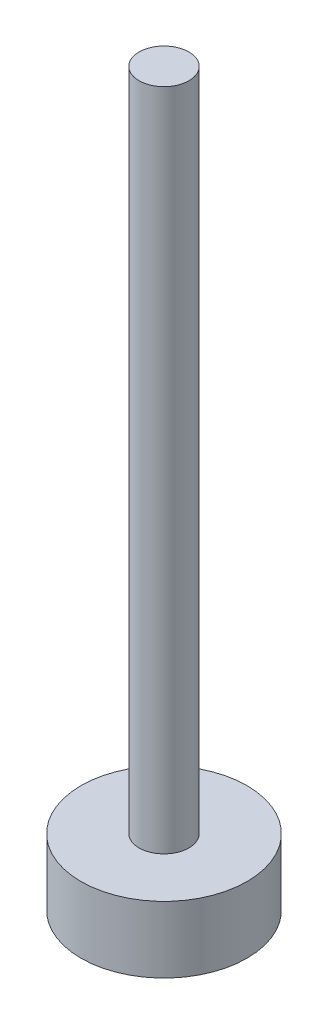
ISO-10303-21;
HEADER;
FILE_DESCRIPTION(('STEP AP214'),'2;1');
FILE_NAME('part.step','',(''),(''),'','','');
FILE_SCHEMA(('AUTOMOTIVE_DESIGN { 1 0 10303 214 1 1 1 1 }'));
ENDSEC;
DATA;
#1=APPLICATION_CONTEXT('core data for automotive mechanical design processes');
#2=APPLICATION_PROTOCOL_DEFINITION('international standard','automotive_design',2000,#1);
#3=PRODUCT_CONTEXT('',#1,'mechanical');
#4=PRODUCT('Part','Part','',(#3));
#5=PRODUCT_RELATED_PRODUCT_CATEGORY('part','',(#4));
#6=PRODUCT_DEFINITION_FORMATION('','',#4);
#7=PRODUCT_DEFINITION_CONTEXT('part definition',#1,'design');
#8=PRODUCT_DEFINITION('design','',#6,#7);
#9=PRODUCT_DEFINITION_SHAPE('','',#8);
#10=(LENGTH_UNIT() NAMED_UNIT(*) SI_UNIT(.MILLI.,.METRE.));
#11=(NAMED_UNIT(*) PLANE_ANGLE_UNIT() SI_UNIT($,.RADIAN.));
#12=(NAMED_UNIT(*) SI_UNIT($,.STERADIAN.) SOLID_ANGLE_UNIT());
#13=UNCERTAINTY_MEASURE_WITH_UNIT(LENGTH_MEASURE(1.E-05),#10,'distance_accuracy_value','');
#14=(GEOMETRIC_REPRESENTATION_CONTEXT(3) GLOBAL_UNCERTAINTY_ASSIGNED_CONTEXT((#13)) GLOBAL_UNIT_ASSIGNED_CONTEXT((#10,
#11,#12)) REPRESENTATION_CONTEXT('',''));
#15=CARTESIAN_POINT('',(0.,0.,0.));
#16=DIRECTION('',(0.,0.,1.));
#17=DIRECTION('',(1.,0.,0.));
#18=AXIS2_PLACEMENT_3D('',#15,#16,#17);
#19=CARTESIAN_POINT('',(0.,20.,0.));
#20=DIRECTION('',(0.,-1.,0.));
#21=DIRECTION('',(0.,0.,-1.));
#22=AXIS2_PLACEMENT_3D('',#19,#20,#21);
#23=CYLINDRICAL_SURFACE('',#22,25.);
#24=CARTESIAN_POINT('',(0.,20.,0.));
#25=DIRECTION('',(0.,1.,0.));
#26=DIRECTION('',(0.,0.,1.));
#27=AXIS2_PLACEMENT_3D('',#24,#25,#26);
#28=CIRCLE('',#27,25.);
#29=CARTESIAN_POINT('',(0.,20.,25.));
#30=VERTEX_POINT('',#29);
#31=EDGE_CURVE('E43',#30,#30,#28,.T.);
#32=ORIENTED_EDGE('',*,*,#31,.F.);
#33=EDGE_LOOP('',(#32));
#34=FACE_BOUND('',#33,.T.);
#35=CARTESIAN_POINT('',(0.,0.,0.));
#36=DIRECTION('',(0.,1.,0.));
#37=DIRECTION('',(0.,0.,1.));
#38=AXIS2_PLACEMENT_3D('',#35,#36,#37);
#39=CIRCLE('',#38,25.);
#40=CARTESIAN_POINT('',(0.,0.,25.));
#41=VERTEX_POINT('',#40);
#42=EDGE_CURVE('E39',#41,#41,#39,.T.);
#43=ORIENTED_EDGE('',*,*,#42,.T.);
#44=EDGE_LOOP('',(#43));
#45=FACE_BOUND('',#44,.T.);
#46=ADVANCED_FACE('F36',(#34,#45),#23,.T.);
#47=CARTESIAN_POINT('',(0.,20.,0.));
#48=DIRECTION('',(0.,1.,0.));
#49=DIRECTION('',(0.,0.,1.));
#50=AXIS2_PLACEMENT_3D('',#47,#48,#49);
#51=PLANE('',#50);
#52=CARTESIAN_POINT('',(0.,20.,0.));
#53=DIRECTION('',(0.,1.,0.));
#54=DIRECTION('',(0.,0.,1.));
#55=AXIS2_PLACEMENT_3D('',#52,#53,#54);
#56=CIRCLE('',#55,7.5);
#57=CARTESIAN_POINT('',(0.,20.,7.5));
#58=VERTEX_POINT('',#57);
#59=EDGE_CURVE('E10',#58,#58,#56,.T.);
#60=ORIENTED_EDGE('',*,*,#59,.F.);
#61=EDGE_LOOP('',(#60));
#62=FACE_BOUND('',#61,.T.);
#63=ORIENTED_EDGE('',*,*,#31,.T.);
#64=EDGE_LOOP('',(#63));
#65=FACE_BOUND('',#64,.T.);
#66=ADVANCED_FACE('F60',(#62,#65),#51,.T.);
#67=CARTESIAN_POINT('',(0.,0.,0.));
#68=DIRECTION('',(0.,1.,0.));
#69=DIRECTION('',(0.,0.,1.));
#70=AXIS2_PLACEMENT_3D('',#67,#68,#69);
#71=PLANE('',#70);
#72=ORIENTED_EDGE('',*,*,#42,.F.);
#73=EDGE_LOOP('',(#72));
#74=FACE_BOUND('',#73,.T.);
#75=ADVANCED_FACE('F57',(#74),#71,.F.);
#76=CARTESIAN_POINT('',(0.,220.,0.));
#77=DIRECTION('',(0.,-1.,0.));
#78=DIRECTION('',(0.,0.,-1.));
#79=AXIS2_PLACEMENT_3D('',#76,#77,#78);
#80=CYLINDRICAL_SURFACE('',#79,7.5);
#81=CARTESIAN_POINT('',(0.,220.,0.));
#82=DIRECTION('',(0.,1.,0.));
#83=DIRECTION('',(0.,0.,1.));
#84=AXIS2_PLACEMENT_3D('',#81,#82,#83);
#85=CIRCLE('',#84,7.5);
#86=CARTESIAN_POINT('',(0.,220.,7.5));
#87=VERTEX_POINT('',#86);
#88=EDGE_CURVE('E49',#87,#87,#85,.T.);
#89=ORIENTED_EDGE('',*,*,#88,.F.);
#90=EDGE_LOOP('',(#89));
#91=FACE_BOUND('',#90,.T.);
#92=ORIENTED_EDGE('',*,*,#59,.T.);
#93=EDGE_LOOP('',(#92));
#94=FACE_BOUND('',#93,.T.);
#95=ADVANCED_FACE('F59',(#91,#94),#80,.T.);
#96=CARTESIAN_POINT('',(0.,220.,0.));
#97=DIRECTION('',(0.,1.,0.));
#98=DIRECTION('',(0.,0.,1.));
#99=AXIS2_PLACEMENT_3D('',#96,#97,#98);
#100=PLANE('',#99);
#101=ORIENTED_EDGE('',*,*,#88,.T.);
#102=EDGE_LOOP('',(#101));
#103=FACE_BOUND('',#102,.T.);
#104=ADVANCED_FACE('F66',(#103),#100,.T.);
#105=CLOSED_SHELL('',(#46,#66,#75,#95,#104));
#106=MANIFOLD_SOLID_BREP('B2',#105);
#107=ADVANCED_BREP_SHAPE_REPRESENTATION('',(#18,#106),#14);
#108=SHAPE_DEFINITION_REPRESENTATION(#9,#107);
ENDSEC;
END-ISO-10303-21;
